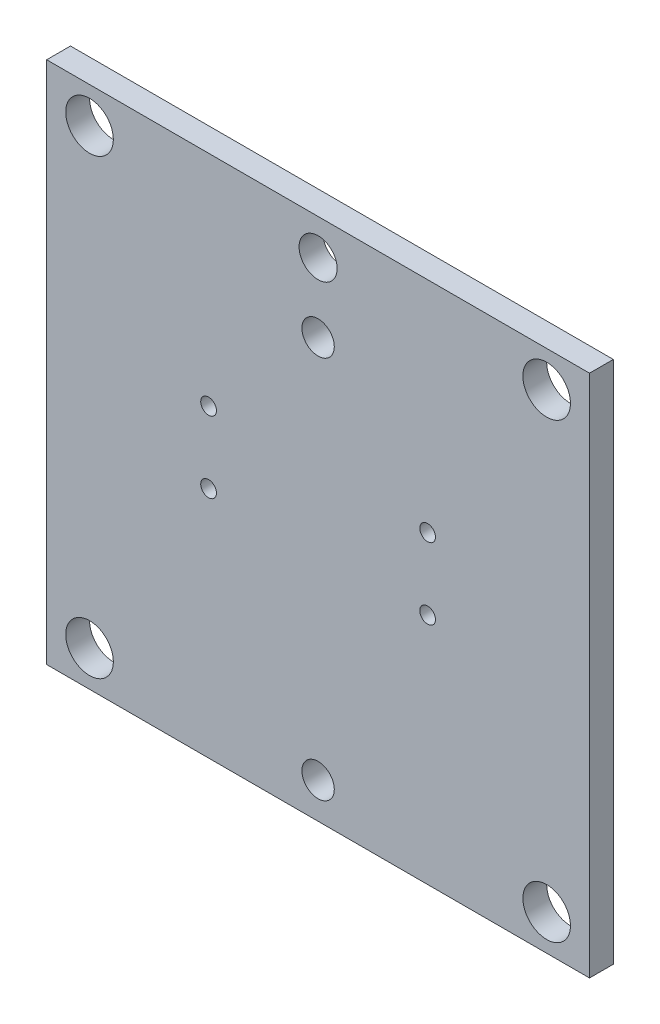
ISO-10303-21;
HEADER;
FILE_DESCRIPTION(('STEP AP214'),'2;1');
FILE_NAME('part.step','',(''),(''),'','','');
FILE_SCHEMA(('AUTOMOTIVE_DESIGN { 1 0 10303 214 1 1 1 1 }'));
ENDSEC;
DATA;
#1=APPLICATION_CONTEXT('core data for automotive mechanical design processes');
#2=APPLICATION_PROTOCOL_DEFINITION('international standard','automotive_design',2000,#1);
#3=PRODUCT_CONTEXT('',#1,'mechanical');
#4=PRODUCT('Part','Part','',(#3));
#5=PRODUCT_RELATED_PRODUCT_CATEGORY('part','',(#4));
#6=PRODUCT_DEFINITION_FORMATION('','',#4);
#7=PRODUCT_DEFINITION_CONTEXT('part definition',#1,'design');
#8=PRODUCT_DEFINITION('design','',#6,#7);
#9=PRODUCT_DEFINITION_SHAPE('','',#8);
#10=(LENGTH_UNIT() NAMED_UNIT(*) SI_UNIT(.MILLI.,.METRE.));
#11=(NAMED_UNIT(*) PLANE_ANGLE_UNIT() SI_UNIT($,.RADIAN.));
#12=(NAMED_UNIT(*) SI_UNIT($,.STERADIAN.) SOLID_ANGLE_UNIT());
#13=UNCERTAINTY_MEASURE_WITH_UNIT(LENGTH_MEASURE(1.E-05),#10,'distance_accuracy_value','');
#14=(GEOMETRIC_REPRESENTATION_CONTEXT(3) GLOBAL_UNCERTAINTY_ASSIGNED_CONTEXT((#13)) GLOBAL_UNIT_ASSIGNED_CONTEXT((#10,
#11,#12)) REPRESENTATION_CONTEXT('',''));
#15=CARTESIAN_POINT('',(0.,0.,0.));
#16=DIRECTION('',(0.,0.,1.));
#17=DIRECTION('',(1.,0.,0.));
#18=AXIS2_PLACEMENT_3D('',#15,#16,#17);
#19=CARTESIAN_POINT('',(0.,0.,2.5));
#20=DIRECTION('',(0.,0.,1.));
#21=DIRECTION('',(1.,0.,0.));
#22=AXIS2_PLACEMENT_3D('',#19,#20,#21);
#23=PLANE('',#22);
#24=CARTESIAN_POINT('',(1.65850595465498E-13,-47.5000000000068,2.5));
#25=DIRECTION('',(0.,0.,1.));
#26=DIRECTION('',(1.,0.,0.));
#27=AXIS2_PLACEMENT_3D('',#24,#25,#26);
#28=CIRCLE('',#27,3.4);
#29=CARTESIAN_POINT('',(3.40000000000017,-47.5000000000068,2.5));
#30=VERTEX_POINT('',#29);
#31=EDGE_CURVE('E176',#30,#30,#28,.T.);
#32=ORIENTED_EDGE('',*,*,#31,.F.);
#33=EDGE_LOOP('',(#32));
#34=FACE_BOUND('',#33,.T.);
#35=CARTESIAN_POINT('',(0.,47.5000000000001,2.5));
#36=DIRECTION('',(0.,0.,1.));
#37=DIRECTION('',(1.,0.,0.));
#38=AXIS2_PLACEMENT_3D('',#35,#36,#37);
#39=CIRCLE('',#38,4.);
#40=CARTESIAN_POINT('',(4.,47.5000000000001,2.5));
#41=VERTEX_POINT('',#40);
#42=EDGE_CURVE('E168',#41,#41,#39,.T.);
#43=ORIENTED_EDGE('',*,*,#42,.F.);
#44=EDGE_LOOP('',(#43));
#45=FACE_BOUND('',#44,.T.);
#46=CARTESIAN_POINT('',(0.,32.9999999999999,2.5));
#47=DIRECTION('',(0.,0.,1.));
#48=DIRECTION('',(1.,0.,0.));
#49=AXIS2_PLACEMENT_3D('',#46,#47,#48);
#50=CIRCLE('',#49,3.4);
#51=CARTESIAN_POINT('',(3.4,32.9999999999999,2.5));
#52=VERTEX_POINT('',#51);
#53=EDGE_CURVE('E164',#52,#52,#50,.T.);
#54=ORIENTED_EDGE('',*,*,#53,.F.);
#55=EDGE_LOOP('',(#54));
#56=FACE_BOUND('',#55,.T.);
#57=CARTESIAN_POINT('',(23.,8.9999999999999,2.5));
#58=DIRECTION('',(0.,0.,1.));
#59=DIRECTION('',(1.,0.,0.));
#60=AXIS2_PLACEMENT_3D('',#57,#58,#59);
#61=CIRCLE('',#60,1.65);
#62=CARTESIAN_POINT('',(24.65,8.9999999999999,2.5));
#63=VERTEX_POINT('',#62);
#64=EDGE_CURVE('E158',#63,#63,#61,.T.);
#65=ORIENTED_EDGE('',*,*,#64,.F.);
#66=EDGE_LOOP('',(#65));
#67=FACE_BOUND('',#66,.T.);
#68=CARTESIAN_POINT('',(23.,-6.,2.5));
#69=DIRECTION('',(0.,0.,1.));
#70=DIRECTION('',(1.,0.,0.));
#71=AXIS2_PLACEMENT_3D('',#68,#69,#70);
#72=CIRCLE('',#71,1.65);
#73=CARTESIAN_POINT('',(24.65,-6.,2.5));
#74=VERTEX_POINT('',#73);
#75=EDGE_CURVE('E152',#74,#74,#72,.T.);
#76=ORIENTED_EDGE('',*,*,#75,.F.);
#77=EDGE_LOOP('',(#76));
#78=FACE_BOUND('',#77,.T.);
#79=CARTESIAN_POINT('',(-23.,8.9999999999999,2.5));
#80=DIRECTION('',(0.,0.,1.));
#81=DIRECTION('',(1.,0.,0.));
#82=AXIS2_PLACEMENT_3D('',#79,#80,#81);
#83=CIRCLE('',#82,1.65);
#84=CARTESIAN_POINT('',(-21.35,8.9999999999999,2.5));
#85=VERTEX_POINT('',#84);
#86=EDGE_CURVE('E146',#85,#85,#83,.T.);
#87=ORIENTED_EDGE('',*,*,#86,.F.);
#88=EDGE_LOOP('',(#87));
#89=FACE_BOUND('',#88,.T.);
#90=CARTESIAN_POINT('',(-23.,-6.,2.5));
#91=DIRECTION('',(0.,0.,1.));
#92=DIRECTION('',(1.,0.,0.));
#93=AXIS2_PLACEMENT_3D('',#90,#91,#92);
#94=CIRCLE('',#93,1.65);
#95=CARTESIAN_POINT('',(-21.35,-6.,2.5));
#96=VERTEX_POINT('',#95);
#97=EDGE_CURVE('E140',#96,#96,#94,.T.);
#98=ORIENTED_EDGE('',*,*,#97,.F.);
#99=EDGE_LOOP('',(#98));
#100=FACE_BOUND('',#99,.T.);
#101=CARTESIAN_POINT('',(-48.,-47.5,2.5));
#102=DIRECTION('',(0.,0.,-1.));
#103=DIRECTION('',(1.,0.,0.));
#104=AXIS2_PLACEMENT_3D('',#101,#102,#103);
#105=CIRCLE('',#104,5.);
#106=CARTESIAN_POINT('',(-43.,-47.5,2.5));
#107=VERTEX_POINT('',#106);
#108=EDGE_CURVE('E120',#107,#107,#105,.T.);
#109=ORIENTED_EDGE('',*,*,#108,.T.);
#110=EDGE_LOOP('',(#109));
#111=FACE_BOUND('',#110,.T.);
#112=CARTESIAN_POINT('',(-48.,47.5,2.5));
#113=DIRECTION('',(0.,0.,1.));
#114=DIRECTION('',(1.,0.,0.));
#115=AXIS2_PLACEMENT_3D('',#112,#113,#114);
#116=CIRCLE('',#115,5.);
#117=CARTESIAN_POINT('',(-43.,47.5,2.5));
#118=VERTEX_POINT('',#117);
#119=EDGE_CURVE('E114',#118,#118,#116,.T.);
#120=ORIENTED_EDGE('',*,*,#119,.F.);
#121=EDGE_LOOP('',(#120));
#122=FACE_BOUND('',#121,.T.);
#123=DIRECTION('',(0.,1.,0.));
#124=VECTOR('',#123,1.);
#125=CARTESIAN_POINT('',(57.,55.,2.5));
#126=LINE('',#125,#124);
#127=CARTESIAN_POINT('',(57.,-55.,2.5));
#128=VERTEX_POINT('',#127);
#129=CARTESIAN_POINT('',(57.,55.,2.5));
#130=VERTEX_POINT('',#129);
#131=EDGE_CURVE('E87',#128,#130,#126,.T.);
#132=ORIENTED_EDGE('',*,*,#131,.T.);
#133=DIRECTION('',(-1.,0.,0.));
#134=VECTOR('',#133,1.);
#135=CARTESIAN_POINT('',(-57.,55.,2.5));
#136=LINE('',#135,#134);
#137=CARTESIAN_POINT('',(-57.,55.,2.5));
#138=VERTEX_POINT('',#137);
#139=EDGE_CURVE('E82',#130,#138,#136,.T.);
#140=ORIENTED_EDGE('',*,*,#139,.T.);
#141=DIRECTION('',(0.,-1.,0.));
#142=VECTOR('',#141,1.);
#143=CARTESIAN_POINT('',(-57.,55.,2.5));
#144=LINE('',#143,#142);
#145=CARTESIAN_POINT('',(-57.,-55.,2.5));
#146=VERTEX_POINT('',#145);
#147=EDGE_CURVE('E85',#138,#146,#144,.T.);
#148=ORIENTED_EDGE('',*,*,#147,.T.);
#149=DIRECTION('',(1.,0.,0.));
#150=VECTOR('',#149,1.);
#151=CARTESIAN_POINT('',(-57.,-55.,2.5));
#152=LINE('',#151,#150);
#153=EDGE_CURVE('E52',#146,#128,#152,.T.);
#154=ORIENTED_EDGE('',*,*,#153,.T.);
#155=EDGE_LOOP('',(#132,#140,#148,#154));
#156=FACE_BOUND('',#155,.T.);
#157=CARTESIAN_POINT('',(48.,-47.5,2.5));
#158=DIRECTION('',(0.,0.,1.));
#159=DIRECTION('',(-1.,0.,0.));
#160=AXIS2_PLACEMENT_3D('',#157,#158,#159);
#161=CIRCLE('',#160,5.);
#162=CARTESIAN_POINT('',(43.,-47.5,2.5));
#163=VERTEX_POINT('',#162);
#164=EDGE_CURVE('E126',#163,#163,#161,.T.);
#165=ORIENTED_EDGE('',*,*,#164,.F.);
#166=EDGE_LOOP('',(#165));
#167=FACE_BOUND('',#166,.T.);
#168=CARTESIAN_POINT('',(48.,47.5,2.5));
#169=DIRECTION('',(0.,0.,-1.));
#170=DIRECTION('',(-1.,0.,0.));
#171=AXIS2_PLACEMENT_3D('',#168,#169,#170);
#172=CIRCLE('',#171,5.);
#173=CARTESIAN_POINT('',(43.,47.5,2.5));
#174=VERTEX_POINT('',#173);
#175=EDGE_CURVE('E132',#174,#174,#172,.T.);
#176=ORIENTED_EDGE('',*,*,#175,.T.);
#177=EDGE_LOOP('',(#176));
#178=FACE_BOUND('',#177,.T.);
#179=ADVANCED_FACE('F35',(#34,#45,#56,#67,#78,#89,#100,#111,#122,#156,#167,#178),#23,.T.);
#180=CARTESIAN_POINT('',(0.,0.,-2.5));
#181=DIRECTION('',(0.,0.,1.));
#182=DIRECTION('',(1.,0.,0.));
#183=AXIS2_PLACEMENT_3D('',#180,#181,#182);
#184=PLANE('',#183);
#185=CARTESIAN_POINT('',(1.65850595465498E-13,-47.5000000000068,-2.5));
#186=DIRECTION('',(0.,0.,1.));
#187=DIRECTION('',(1.,0.,0.));
#188=AXIS2_PLACEMENT_3D('',#185,#186,#187);
#189=CIRCLE('',#188,3.4);
#190=CARTESIAN_POINT('',(3.40000000000016,-47.5000000000068,-2.5));
#191=VERTEX_POINT('',#190);
#192=EDGE_CURVE('E171',#191,#191,#189,.T.);
#193=ORIENTED_EDGE('',*,*,#192,.T.);
#194=EDGE_LOOP('',(#193));
#195=FACE_BOUND('',#194,.T.);
#196=CARTESIAN_POINT('',(0.,47.5000000000001,-2.5));
#197=DIRECTION('',(0.,0.,1.));
#198=DIRECTION('',(1.,0.,0.));
#199=AXIS2_PLACEMENT_3D('',#196,#197,#198);
#200=CIRCLE('',#199,4.);
#201=CARTESIAN_POINT('',(4.,47.5000000000001,-2.5));
#202=VERTEX_POINT('',#201);
#203=EDGE_CURVE('E167',#202,#202,#200,.T.);
#204=ORIENTED_EDGE('',*,*,#203,.T.);
#205=EDGE_LOOP('',(#204));
#206=FACE_BOUND('',#205,.T.);
#207=CARTESIAN_POINT('',(0.,32.9999999999999,-2.5));
#208=DIRECTION('',(0.,0.,1.));
#209=DIRECTION('',(1.,0.,0.));
#210=AXIS2_PLACEMENT_3D('',#207,#208,#209);
#211=CIRCLE('',#210,3.4);
#212=CARTESIAN_POINT('',(3.4,32.9999999999999,-2.5));
#213=VERTEX_POINT('',#212);
#214=EDGE_CURVE('E161',#213,#213,#211,.T.);
#215=ORIENTED_EDGE('',*,*,#214,.T.);
#216=EDGE_LOOP('',(#215));
#217=FACE_BOUND('',#216,.T.);
#218=CARTESIAN_POINT('',(23.,8.9999999999999,-2.5));
#219=DIRECTION('',(0.,0.,1.));
#220=DIRECTION('',(1.,0.,0.));
#221=AXIS2_PLACEMENT_3D('',#218,#219,#220);
#222=CIRCLE('',#221,1.65);
#223=CARTESIAN_POINT('',(24.65,8.9999999999999,-2.5));
#224=VERTEX_POINT('',#223);
#225=EDGE_CURVE('E155',#224,#224,#222,.T.);
#226=ORIENTED_EDGE('',*,*,#225,.T.);
#227=EDGE_LOOP('',(#226));
#228=FACE_BOUND('',#227,.T.);
#229=CARTESIAN_POINT('',(23.,-6.,-2.5));
#230=DIRECTION('',(0.,0.,1.));
#231=DIRECTION('',(1.,0.,0.));
#232=AXIS2_PLACEMENT_3D('',#229,#230,#231);
#233=CIRCLE('',#232,1.65);
#234=CARTESIAN_POINT('',(24.65,-6.,-2.5));
#235=VERTEX_POINT('',#234);
#236=EDGE_CURVE('E149',#235,#235,#233,.T.);
#237=ORIENTED_EDGE('',*,*,#236,.T.);
#238=EDGE_LOOP('',(#237));
#239=FACE_BOUND('',#238,.T.);
#240=CARTESIAN_POINT('',(-23.,8.9999999999999,-2.5));
#241=DIRECTION('',(0.,0.,1.));
#242=DIRECTION('',(1.,0.,0.));
#243=AXIS2_PLACEMENT_3D('',#240,#241,#242);
#244=CIRCLE('',#243,1.65);
#245=CARTESIAN_POINT('',(-21.35,8.9999999999999,-2.5));
#246=VERTEX_POINT('',#245);
#247=EDGE_CURVE('E143',#246,#246,#244,.T.);
#248=ORIENTED_EDGE('',*,*,#247,.T.);
#249=EDGE_LOOP('',(#248));
#250=FACE_BOUND('',#249,.T.);
#251=CARTESIAN_POINT('',(-23.,-6.,-2.5));
#252=DIRECTION('',(0.,0.,1.));
#253=DIRECTION('',(1.,0.,0.));
#254=AXIS2_PLACEMENT_3D('',#251,#252,#253);
#255=CIRCLE('',#254,1.65);
#256=CARTESIAN_POINT('',(-21.35,-6.,-2.5));
#257=VERTEX_POINT('',#256);
#258=EDGE_CURVE('E135',#257,#257,#255,.T.);
#259=ORIENTED_EDGE('',*,*,#258,.T.);
#260=EDGE_LOOP('',(#259));
#261=FACE_BOUND('',#260,.T.);
#262=CARTESIAN_POINT('',(-48.,-47.5,-2.5));
#263=DIRECTION('',(0.,0.,-1.));
#264=DIRECTION('',(1.,0.,0.));
#265=AXIS2_PLACEMENT_3D('',#262,#263,#264);
#266=CIRCLE('',#265,5.);
#267=CARTESIAN_POINT('',(-43.,-47.5,-2.5));
#268=VERTEX_POINT('',#267);
#269=EDGE_CURVE('E117',#268,#268,#266,.T.);
#270=ORIENTED_EDGE('',*,*,#269,.F.);
#271=EDGE_LOOP('',(#270));
#272=FACE_BOUND('',#271,.T.);
#273=CARTESIAN_POINT('',(-48.,47.5,-2.5));
#274=DIRECTION('',(0.,0.,1.));
#275=DIRECTION('',(1.,0.,0.));
#276=AXIS2_PLACEMENT_3D('',#273,#274,#275);
#277=CIRCLE('',#276,5.);
#278=CARTESIAN_POINT('',(-43.,47.5,-2.5));
#279=VERTEX_POINT('',#278);
#280=EDGE_CURVE('E102',#279,#279,#277,.T.);
#281=ORIENTED_EDGE('',*,*,#280,.T.);
#282=EDGE_LOOP('',(#281));
#283=FACE_BOUND('',#282,.T.);
#284=DIRECTION('',(0.,1.,0.));
#285=VECTOR('',#284,1.);
#286=CARTESIAN_POINT('',(57.,55.,-2.5));
#287=LINE('',#286,#285);
#288=CARTESIAN_POINT('',(57.,-55.,-2.5));
#289=VERTEX_POINT('',#288);
#290=CARTESIAN_POINT('',(57.,55.,-2.5));
#291=VERTEX_POINT('',#290);
#292=EDGE_CURVE('E99',#289,#291,#287,.T.);
#293=ORIENTED_EDGE('',*,*,#292,.F.);
#294=DIRECTION('',(1.,0.,0.));
#295=VECTOR('',#294,1.);
#296=CARTESIAN_POINT('',(-57.,-55.,-2.5));
#297=LINE('',#296,#295);
#298=CARTESIAN_POINT('',(-57.,-55.,-2.5));
#299=VERTEX_POINT('',#298);
#300=EDGE_CURVE('E75',#299,#289,#297,.T.);
#301=ORIENTED_EDGE('',*,*,#300,.F.);
#302=DIRECTION('',(0.,-1.,0.));
#303=VECTOR('',#302,1.);
#304=CARTESIAN_POINT('',(-57.,55.,-2.5));
#305=LINE('',#304,#303);
#306=CARTESIAN_POINT('',(-57.,55.,-2.5));
#307=VERTEX_POINT('',#306);
#308=EDGE_CURVE('E69',#307,#299,#305,.T.);
#309=ORIENTED_EDGE('',*,*,#308,.F.);
#310=DIRECTION('',(-1.,0.,0.));
#311=VECTOR('',#310,1.);
#312=CARTESIAN_POINT('',(-57.,55.,-2.5));
#313=LINE('',#312,#311);
#314=EDGE_CURVE('E91',#291,#307,#313,.T.);
#315=ORIENTED_EDGE('',*,*,#314,.F.);
#316=EDGE_LOOP('',(#293,#301,#309,#315));
#317=FACE_BOUND('',#316,.T.);
#318=CARTESIAN_POINT('',(48.,-47.5,-2.5));
#319=DIRECTION('',(0.,0.,1.));
#320=DIRECTION('',(-1.,0.,0.));
#321=AXIS2_PLACEMENT_3D('',#318,#319,#320);
#322=CIRCLE('',#321,5.);
#323=CARTESIAN_POINT('',(43.,-47.5,-2.5));
#324=VERTEX_POINT('',#323);
#325=EDGE_CURVE('E123',#324,#324,#322,.T.);
#326=ORIENTED_EDGE('',*,*,#325,.T.);
#327=EDGE_LOOP('',(#326));
#328=FACE_BOUND('',#327,.T.);
#329=CARTESIAN_POINT('',(48.,47.5,-2.5));
#330=DIRECTION('',(0.,0.,-1.));
#331=DIRECTION('',(-1.,0.,0.));
#332=AXIS2_PLACEMENT_3D('',#329,#330,#331);
#333=CIRCLE('',#332,5.);
#334=CARTESIAN_POINT('',(43.,47.5,-2.5));
#335=VERTEX_POINT('',#334);
#336=EDGE_CURVE('E129',#335,#335,#333,.T.);
#337=ORIENTED_EDGE('',*,*,#336,.F.);
#338=EDGE_LOOP('',(#337));
#339=FACE_BOUND('',#338,.T.);
#340=ADVANCED_FACE('F110',(#195,#206,#217,#228,#239,#250,#261,#272,#283,#317,#328,#339),#184,.F.);
#341=CARTESIAN_POINT('',(57.,55.,2.5));
#342=DIRECTION('',(-1.,0.,0.));
#343=DIRECTION('',(0.,-1.,0.));
#344=AXIS2_PLACEMENT_3D('',#341,#342,#343);
#345=PLANE('',#344);
#346=ORIENTED_EDGE('',*,*,#292,.T.);
#347=DIRECTION('',(0.,0.,-1.));
#348=VECTOR('',#347,1.);
#349=CARTESIAN_POINT('',(57.,55.,2.5));
#350=LINE('',#349,#348);
#351=EDGE_CURVE('E11',#130,#291,#350,.T.);
#352=ORIENTED_EDGE('',*,*,#351,.F.);
#353=ORIENTED_EDGE('',*,*,#131,.F.);
#354=DIRECTION('',(0.,0.,-1.));
#355=VECTOR('',#354,1.);
#356=CARTESIAN_POINT('',(57.,-55.,2.5));
#357=LINE('',#356,#355);
#358=EDGE_CURVE('E95',#128,#289,#357,.T.);
#359=ORIENTED_EDGE('',*,*,#358,.T.);
#360=EDGE_LOOP('',(#346,#352,#353,#359));
#361=FACE_BOUND('',#360,.T.);
#362=ADVANCED_FACE('F37',(#361),#345,.F.);
#363=CARTESIAN_POINT('',(-57.,55.,2.5));
#364=DIRECTION('',(0.,-1.,0.));
#365=DIRECTION('',(0.,0.,-1.));
#366=AXIS2_PLACEMENT_3D('',#363,#364,#365);
#367=PLANE('',#366);
#368=ORIENTED_EDGE('',*,*,#314,.T.);
#369=DIRECTION('',(0.,0.,-1.));
#370=VECTOR('',#369,1.);
#371=CARTESIAN_POINT('',(-57.,55.,2.5));
#372=LINE('',#371,#370);
#373=EDGE_CURVE('E44',#138,#307,#372,.T.);
#374=ORIENTED_EDGE('',*,*,#373,.F.);
#375=ORIENTED_EDGE('',*,*,#139,.F.);
#376=ORIENTED_EDGE('',*,*,#351,.T.);
#377=EDGE_LOOP('',(#368,#374,#375,#376));
#378=FACE_BOUND('',#377,.T.);
#379=ADVANCED_FACE('F90',(#378),#367,.F.);
#380=CARTESIAN_POINT('',(-57.,55.,2.5));
#381=DIRECTION('',(1.,0.,0.));
#382=DIRECTION('',(0.,0.,-1.));
#383=AXIS2_PLACEMENT_3D('',#380,#381,#382);
#384=PLANE('',#383);
#385=ORIENTED_EDGE('',*,*,#308,.T.);
#386=DIRECTION('',(0.,0.,-1.));
#387=VECTOR('',#386,1.);
#388=CARTESIAN_POINT('',(-57.,-55.,2.5));
#389=LINE('',#388,#387);
#390=EDGE_CURVE('E92',#146,#299,#389,.T.);
#391=ORIENTED_EDGE('',*,*,#390,.F.);
#392=ORIENTED_EDGE('',*,*,#147,.F.);
#393=ORIENTED_EDGE('',*,*,#373,.T.);
#394=EDGE_LOOP('',(#385,#391,#392,#393));
#395=FACE_BOUND('',#394,.T.);
#396=ADVANCED_FACE('F93',(#395),#384,.F.);
#397=CARTESIAN_POINT('',(-57.,-55.,2.5));
#398=DIRECTION('',(0.,1.,0.));
#399=DIRECTION('',(0.,0.,1.));
#400=AXIS2_PLACEMENT_3D('',#397,#398,#399);
#401=PLANE('',#400);
#402=ORIENTED_EDGE('',*,*,#300,.T.);
#403=ORIENTED_EDGE('',*,*,#358,.F.);
#404=ORIENTED_EDGE('',*,*,#153,.F.);
#405=ORIENTED_EDGE('',*,*,#390,.T.);
#406=EDGE_LOOP('',(#402,#403,#404,#405));
#407=FACE_BOUND('',#406,.T.);
#408=ADVANCED_FACE('F107',(#407),#401,.F.);
#409=CARTESIAN_POINT('',(-48.,47.5,-2.5));
#410=DIRECTION('',(0.,0.,1.));
#411=DIRECTION('',(1.,0.,0.));
#412=AXIS2_PLACEMENT_3D('',#409,#410,#411);
#413=CYLINDRICAL_SURFACE('',#412,5.);
#414=ORIENTED_EDGE('',*,*,#280,.F.);
#415=EDGE_LOOP('',(#414));
#416=FACE_BOUND('',#415,.T.);
#417=ORIENTED_EDGE('',*,*,#119,.T.);
#418=EDGE_LOOP('',(#417));
#419=FACE_BOUND('',#418,.T.);
#420=ADVANCED_FACE('F201',(#416,#419),#413,.F.);
#421=CARTESIAN_POINT('',(-48.,-47.5,-2.5));
#422=DIRECTION('',(0.,0.,1.));
#423=DIRECTION('',(1.,0.,0.));
#424=AXIS2_PLACEMENT_3D('',#421,#422,#423);
#425=CYLINDRICAL_SURFACE('',#424,5.);
#426=ORIENTED_EDGE('',*,*,#269,.T.);
#427=EDGE_LOOP('',(#426));
#428=FACE_BOUND('',#427,.T.);
#429=ORIENTED_EDGE('',*,*,#108,.F.);
#430=EDGE_LOOP('',(#429));
#431=FACE_BOUND('',#430,.T.);
#432=ADVANCED_FACE('F203',(#428,#431),#425,.F.);
#433=CARTESIAN_POINT('',(48.,-47.5,-2.5));
#434=DIRECTION('',(0.,0.,1.));
#435=DIRECTION('',(1.,0.,0.));
#436=AXIS2_PLACEMENT_3D('',#433,#434,#435);
#437=CYLINDRICAL_SURFACE('',#436,5.);
#438=ORIENTED_EDGE('',*,*,#325,.F.);
#439=EDGE_LOOP('',(#438));
#440=FACE_BOUND('',#439,.T.);
#441=ORIENTED_EDGE('',*,*,#164,.T.);
#442=EDGE_LOOP('',(#441));
#443=FACE_BOUND('',#442,.T.);
#444=ADVANCED_FACE('F210',(#440,#443),#437,.F.);
#445=CARTESIAN_POINT('',(48.,47.5,-2.5));
#446=DIRECTION('',(0.,0.,1.));
#447=DIRECTION('',(1.,0.,0.));
#448=AXIS2_PLACEMENT_3D('',#445,#446,#447);
#449=CYLINDRICAL_SURFACE('',#448,5.);
#450=ORIENTED_EDGE('',*,*,#336,.T.);
#451=EDGE_LOOP('',(#450));
#452=FACE_BOUND('',#451,.T.);
#453=ORIENTED_EDGE('',*,*,#175,.F.);
#454=EDGE_LOOP('',(#453));
#455=FACE_BOUND('',#454,.T.);
#456=ADVANCED_FACE('F299',(#452,#455),#449,.F.);
#457=CARTESIAN_POINT('',(-23.,-6.,2.5));
#458=DIRECTION('',(0.,0.,1.));
#459=DIRECTION('',(1.,0.,0.));
#460=AXIS2_PLACEMENT_3D('',#457,#458,#459);
#461=CYLINDRICAL_SURFACE('',#460,1.65);
#462=ORIENTED_EDGE('',*,*,#258,.F.);
#463=EDGE_LOOP('',(#462));
#464=FACE_BOUND('',#463,.T.);
#465=ORIENTED_EDGE('',*,*,#97,.T.);
#466=EDGE_LOOP('',(#465));
#467=FACE_BOUND('',#466,.T.);
#468=ADVANCED_FACE('F289',(#464,#467),#461,.F.);
#469=CARTESIAN_POINT('',(-23.,8.9999999999999,2.5));
#470=DIRECTION('',(0.,0.,1.));
#471=DIRECTION('',(1.,0.,0.));
#472=AXIS2_PLACEMENT_3D('',#469,#470,#471);
#473=CYLINDRICAL_SURFACE('',#472,1.65);
#474=ORIENTED_EDGE('',*,*,#247,.F.);
#475=EDGE_LOOP('',(#474));
#476=FACE_BOUND('',#475,.T.);
#477=ORIENTED_EDGE('',*,*,#86,.T.);
#478=EDGE_LOOP('',(#477));
#479=FACE_BOUND('',#478,.T.);
#480=ADVANCED_FACE('F279',(#476,#479),#473,.F.);
#481=CARTESIAN_POINT('',(23.,-6.,2.5));
#482=DIRECTION('',(0.,0.,1.));
#483=DIRECTION('',(1.,0.,0.));
#484=AXIS2_PLACEMENT_3D('',#481,#482,#483);
#485=CYLINDRICAL_SURFACE('',#484,1.65);
#486=ORIENTED_EDGE('',*,*,#236,.F.);
#487=EDGE_LOOP('',(#486));
#488=FACE_BOUND('',#487,.T.);
#489=ORIENTED_EDGE('',*,*,#75,.T.);
#490=EDGE_LOOP('',(#489));
#491=FACE_BOUND('',#490,.T.);
#492=ADVANCED_FACE('F269',(#488,#491),#485,.F.);
#493=CARTESIAN_POINT('',(23.,8.9999999999999,2.5));
#494=DIRECTION('',(0.,0.,1.));
#495=DIRECTION('',(1.,0.,0.));
#496=AXIS2_PLACEMENT_3D('',#493,#494,#495);
#497=CYLINDRICAL_SURFACE('',#496,1.65);
#498=ORIENTED_EDGE('',*,*,#225,.F.);
#499=EDGE_LOOP('',(#498));
#500=FACE_BOUND('',#499,.T.);
#501=ORIENTED_EDGE('',*,*,#64,.T.);
#502=EDGE_LOOP('',(#501));
#503=FACE_BOUND('',#502,.T.);
#504=ADVANCED_FACE('F259',(#500,#503),#497,.F.);
#505=CARTESIAN_POINT('',(0.,32.9999999999999,2.5));
#506=DIRECTION('',(0.,0.,1.));
#507=DIRECTION('',(1.,0.,0.));
#508=AXIS2_PLACEMENT_3D('',#505,#506,#507);
#509=CYLINDRICAL_SURFACE('',#508,3.4);
#510=ORIENTED_EDGE('',*,*,#214,.F.);
#511=EDGE_LOOP('',(#510));
#512=FACE_BOUND('',#511,.T.);
#513=ORIENTED_EDGE('',*,*,#53,.T.);
#514=EDGE_LOOP('',(#513));
#515=FACE_BOUND('',#514,.T.);
#516=ADVANCED_FACE('F247',(#512,#515),#509,.F.);
#517=CARTESIAN_POINT('',(0.,47.5000000000001,-2.5));
#518=DIRECTION('',(0.,0.,1.));
#519=DIRECTION('',(1.,0.,0.));
#520=AXIS2_PLACEMENT_3D('',#517,#518,#519);
#521=CYLINDRICAL_SURFACE('',#520,4.);
#522=ORIENTED_EDGE('',*,*,#203,.F.);
#523=EDGE_LOOP('',(#522));
#524=FACE_BOUND('',#523,.T.);
#525=ORIENTED_EDGE('',*,*,#42,.T.);
#526=EDGE_LOOP('',(#525));
#527=FACE_BOUND('',#526,.T.);
#528=ADVANCED_FACE('F242',(#524,#527),#521,.F.);
#529=CARTESIAN_POINT('',(1.65850595465498E-13,-47.5000000000068,2.5));
#530=DIRECTION('',(0.,0.,1.));
#531=DIRECTION('',(1.,0.,0.));
#532=AXIS2_PLACEMENT_3D('',#529,#530,#531);
#533=CYLINDRICAL_SURFACE('',#532,3.4);
#534=ORIENTED_EDGE('',*,*,#192,.F.);
#535=EDGE_LOOP('',(#534));
#536=FACE_BOUND('',#535,.T.);
#537=ORIENTED_EDGE('',*,*,#31,.T.);
#538=EDGE_LOOP('',(#537));
#539=FACE_BOUND('',#538,.T.);
#540=ADVANCED_FACE('F180',(#536,#539),#533,.F.);
#541=CLOSED_SHELL('',(#179,#340,#362,#379,#396,#408,#420,#432,#444,#456,#468,#480,#492,#504,
#516,#528,#540));
#542=MANIFOLD_SOLID_BREP('B2',#541);
#543=ADVANCED_BREP_SHAPE_REPRESENTATION('',(#18,#542),#14);
#544=SHAPE_DEFINITION_REPRESENTATION(#9,#543);
ENDSEC;
END-ISO-10303-21;
